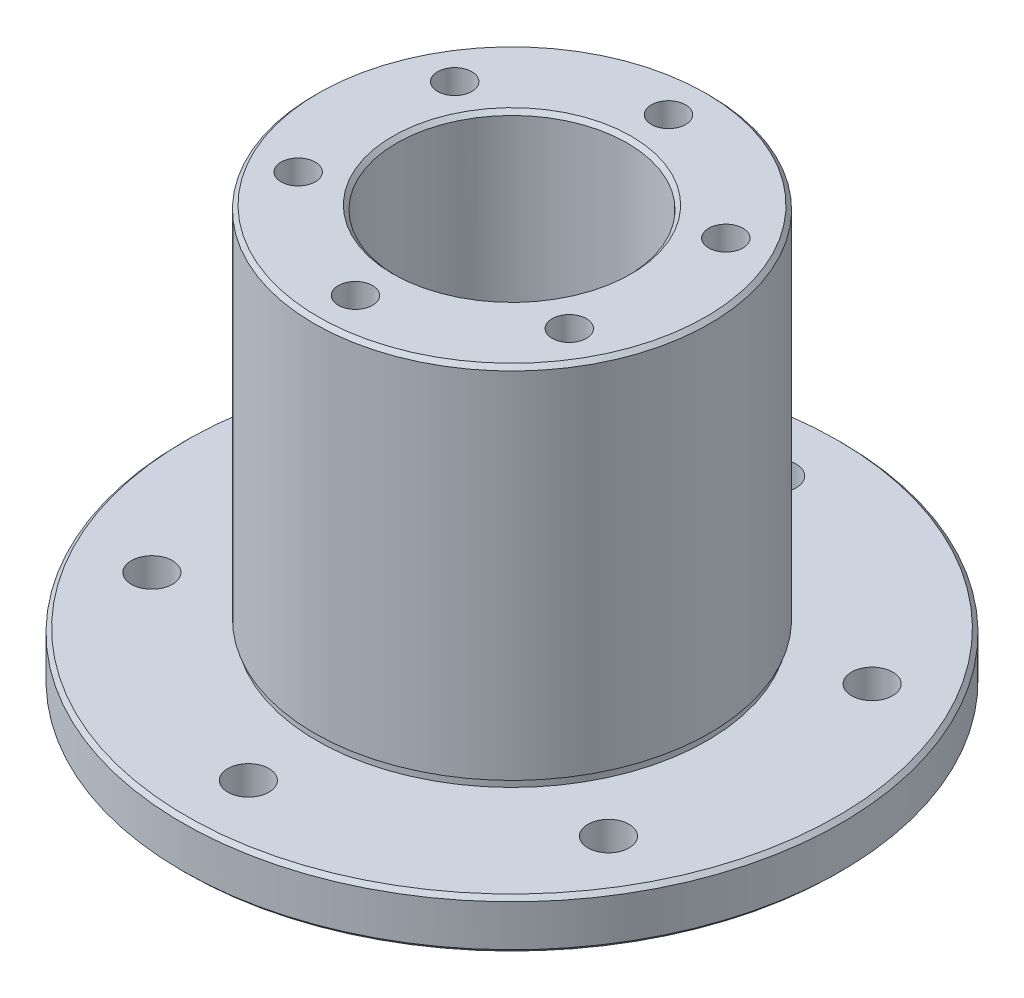
ISO-10303-21;
HEADER;
FILE_DESCRIPTION(('STEP AP214'),'2;1');
FILE_NAME('part.step','',(''),(''),'','','');
FILE_SCHEMA(('AUTOMOTIVE_DESIGN { 1 0 10303 214 1 1 1 1 }'));
ENDSEC;
DATA;
#1=APPLICATION_CONTEXT('core data for automotive mechanical design processes');
#2=APPLICATION_PROTOCOL_DEFINITION('international standard','automotive_design',2000,#1);
#3=PRODUCT_CONTEXT('',#1,'mechanical');
#4=PRODUCT('Part','Part','',(#3));
#5=PRODUCT_RELATED_PRODUCT_CATEGORY('part','',(#4));
#6=PRODUCT_DEFINITION_FORMATION('','',#4);
#7=PRODUCT_DEFINITION_CONTEXT('part definition',#1,'design');
#8=PRODUCT_DEFINITION('design','',#6,#7);
#9=PRODUCT_DEFINITION_SHAPE('','',#8);
#10=(LENGTH_UNIT() NAMED_UNIT(*) SI_UNIT(.MILLI.,.METRE.));
#11=(NAMED_UNIT(*) PLANE_ANGLE_UNIT() SI_UNIT($,.RADIAN.));
#12=(NAMED_UNIT(*) SI_UNIT($,.STERADIAN.) SOLID_ANGLE_UNIT());
#13=UNCERTAINTY_MEASURE_WITH_UNIT(LENGTH_MEASURE(1.E-05),#10,'distance_accuracy_value','');
#14=(GEOMETRIC_REPRESENTATION_CONTEXT(3) GLOBAL_UNCERTAINTY_ASSIGNED_CONTEXT((#13)) GLOBAL_UNIT_ASSIGNED_CONTEXT((#10,
#11,#12)) REPRESENTATION_CONTEXT('',''));
#15=CARTESIAN_POINT('',(0.,0.,0.));
#16=DIRECTION('',(0.,0.,1.));
#17=DIRECTION('',(1.,0.,0.));
#18=AXIS2_PLACEMENT_3D('',#15,#16,#17);
#19=CARTESIAN_POINT('',(0.,-24.5947682827518,0.));
#20=DIRECTION('',(0.,1.,0.));
#21=DIRECTION('',(0.,0.,1.));
#22=AXIS2_PLACEMENT_3D('',#19,#20,#21);
#23=CONICAL_SURFACE('',#22,31.7500000000005,0.785398163399998);
#24=CARTESIAN_POINT('',(0.,-24.9757682827508,0.));
#25=DIRECTION('',(0.,1.,0.));
#26=DIRECTION('',(0.,0.,1.));
#27=AXIS2_PLACEMENT_3D('',#24,#25,#26);
#28=CIRCLE('',#27,31.3689999999995);
#29=CARTESIAN_POINT('',(0.,-24.9757682827508,31.3689999999995));
#30=VERTEX_POINT('',#29);
#31=EDGE_CURVE('E20',#30,#30,#28,.F.);
#32=ORIENTED_EDGE('',*,*,#31,.F.);
#33=EDGE_LOOP('',(#32));
#34=FACE_BOUND('',#33,.T.);
#35=CARTESIAN_POINT('',(0.,-24.5947682827513,0.));
#36=DIRECTION('',(0.,-1.,0.));
#37=DIRECTION('',(0.,0.,-1.));
#38=AXIS2_PLACEMENT_3D('',#35,#36,#37);
#39=CIRCLE('',#38,31.75);
#40=CARTESIAN_POINT('',(0.,-24.5947682827513,-31.75));
#41=VERTEX_POINT('',#40);
#42=EDGE_CURVE('E81',#41,#41,#39,.F.);
#43=ORIENTED_EDGE('',*,*,#42,.F.);
#44=EDGE_LOOP('',(#43));
#45=FACE_BOUND('',#44,.T.);
#46=ADVANCED_FACE('F17',(#34,#45),#23,.T.);
#47=CARTESIAN_POINT('',(21.43125,-24.9757682827513,0.));
#48=DIRECTION('',(0.,-1.,0.));
#49=DIRECTION('',(0.,0.,-1.));
#50=AXIS2_PLACEMENT_3D('',#47,#48,#49);
#51=PLANE('',#50);
#52=ORIENTED_EDGE('',*,*,#31,.T.);
#53=EDGE_LOOP('',(#52));
#54=FACE_BOUND('',#53,.T.);
#55=CARTESIAN_POINT('',(0.,-24.9757682827508,0.));
#56=DIRECTION('',(0.,-1.,0.));
#57=DIRECTION('',(0.,0.,-1.));
#58=AXIS2_PLACEMENT_3D('',#55,#56,#57);
#59=CIRCLE('',#58,11.4935000000005);
#60=CARTESIAN_POINT('',(0.,-24.9757682827508,-11.4935000000005));
#61=VERTEX_POINT('',#60);
#62=EDGE_CURVE('E84',#61,#61,#59,.F.);
#63=ORIENTED_EDGE('',*,*,#62,.T.);
#64=EDGE_LOOP('',(#63));
#65=FACE_BOUND('',#64,.T.);
#66=CARTESIAN_POINT('',(0.,-24.9757682827513,25.4));
#67=DIRECTION('',(0.,-1.,0.));
#68=DIRECTION('',(0.,0.,-1.));
#69=AXIS2_PLACEMENT_3D('',#66,#67,#68);
#70=CIRCLE('',#69,1.9812);
#71=CARTESIAN_POINT('',(0.,-24.9757682827513,23.4188));
#72=VERTEX_POINT('',#71);
#73=EDGE_CURVE('E78',#72,#72,#70,.F.);
#74=ORIENTED_EDGE('',*,*,#73,.T.);
#75=EDGE_LOOP('',(#74));
#76=FACE_BOUND('',#75,.T.);
#77=CARTESIAN_POINT('',(-21.9970452561247,-24.9757682827513,12.7));
#78=DIRECTION('',(0.,-1.,0.));
#79=DIRECTION('',(0.,0.,-1.));
#80=AXIS2_PLACEMENT_3D('',#77,#78,#79);
#81=CIRCLE('',#80,1.9812);
#82=CARTESIAN_POINT('',(-21.9970452561247,-24.9757682827513,10.7188));
#83=VERTEX_POINT('',#82);
#84=EDGE_CURVE('E138',#83,#83,#81,.F.);
#85=ORIENTED_EDGE('',*,*,#84,.T.);
#86=EDGE_LOOP('',(#85));
#87=FACE_BOUND('',#86,.T.);
#88=CARTESIAN_POINT('',(-21.9970452561247,-24.9757682827513,-12.7));
#89=DIRECTION('',(0.,-1.,0.));
#90=DIRECTION('',(1.,0.,0.));
#91=AXIS2_PLACEMENT_3D('',#88,#89,#90);
#92=CIRCLE('',#91,1.9812);
#93=CARTESIAN_POINT('',(-20.0158452561247,-24.9757682827513,-12.7));
#94=VERTEX_POINT('',#93);
#95=EDGE_CURVE('E141',#94,#94,#92,.F.);
#96=ORIENTED_EDGE('',*,*,#95,.T.);
#97=EDGE_LOOP('',(#96));
#98=FACE_BOUND('',#97,.T.);
#99=CARTESIAN_POINT('',(0.,-24.9757682827513,-25.4));
#100=DIRECTION('',(0.,-1.,0.));
#101=DIRECTION('',(1.,0.,0.));
#102=AXIS2_PLACEMENT_3D('',#99,#100,#101);
#103=CIRCLE('',#102,1.9812);
#104=CARTESIAN_POINT('',(1.98119999999999,-24.9757682827513,-25.4));
#105=VERTEX_POINT('',#104);
#106=EDGE_CURVE('E144',#105,#105,#103,.F.);
#107=ORIENTED_EDGE('',*,*,#106,.T.);
#108=EDGE_LOOP('',(#107));
#109=FACE_BOUND('',#108,.T.);
#110=CARTESIAN_POINT('',(21.9970452561247,-24.9757682827513,-12.7));
#111=DIRECTION('',(0.,-1.,0.));
#112=DIRECTION('',(1.,0.,0.));
#113=AXIS2_PLACEMENT_3D('',#110,#111,#112);
#114=CIRCLE('',#113,1.9812);
#115=CARTESIAN_POINT('',(23.9782452561247,-24.9757682827513,-12.7));
#116=VERTEX_POINT('',#115);
#117=EDGE_CURVE('E147',#116,#116,#114,.F.);
#118=ORIENTED_EDGE('',*,*,#117,.T.);
#119=EDGE_LOOP('',(#118));
#120=FACE_BOUND('',#119,.T.);
#121=CARTESIAN_POINT('',(21.9970452561248,-24.9757682827513,12.7));
#122=DIRECTION('',(0.,-1.,0.));
#123=DIRECTION('',(0.,0.,-1.));
#124=AXIS2_PLACEMENT_3D('',#121,#122,#123);
#125=CIRCLE('',#124,1.9812);
#126=CARTESIAN_POINT('',(21.9970452561248,-24.9757682827513,10.7188));
#127=VERTEX_POINT('',#126);
#128=EDGE_CURVE('E150',#127,#127,#125,.F.);
#129=ORIENTED_EDGE('',*,*,#128,.T.);
#130=EDGE_LOOP('',(#129));
#131=FACE_BOUND('',#130,.T.);
#132=ADVANCED_FACE('F155',(#54,#65,#76,#87,#98,#109,#120,#131),#51,.T.);
#133=CARTESIAN_POINT('',(0.,-22.5945182827513,0.));
#134=DIRECTION('',(0.,-1.,0.));
#135=DIRECTION('',(0.,0.,-1.));
#136=AXIS2_PLACEMENT_3D('',#133,#134,#135);
#137=CYLINDRICAL_SURFACE('',#136,31.75);
#138=CARTESIAN_POINT('',(0.,-20.5942682827508,0.));
#139=DIRECTION('',(0.,-1.,0.));
#140=DIRECTION('',(-1.,0.,0.));
#141=AXIS2_PLACEMENT_3D('',#138,#139,#140);
#142=CIRCLE('',#141,31.7500000000005);
#143=CARTESIAN_POINT('',(-31.7500000000005,-20.5942682827508,0.));
#144=VERTEX_POINT('',#143);
#145=EDGE_CURVE('E73',#144,#144,#142,.F.);
#146=ORIENTED_EDGE('',*,*,#145,.F.);
#147=EDGE_LOOP('',(#146));
#148=FACE_BOUND('',#147,.T.);
#149=ORIENTED_EDGE('',*,*,#42,.T.);
#150=EDGE_LOOP('',(#149));
#151=FACE_BOUND('',#150,.T.);
#152=ADVANCED_FACE('F161',(#148,#151),#137,.T.);
#153=CARTESIAN_POINT('',(0.,-24.9757682827508,0.));
#154=DIRECTION('',(0.,-1.,0.));
#155=DIRECTION('',(0.,0.,-1.));
#156=AXIS2_PLACEMENT_3D('',#153,#154,#155);
#157=CONICAL_SURFACE('',#156,11.4935000000005,0.78539816340001);
#158=CARTESIAN_POINT('',(0.,-24.5947682827513,0.));
#159=DIRECTION('',(0.,-1.,0.));
#160=DIRECTION('',(0.,0.,-1.));
#161=AXIS2_PLACEMENT_3D('',#158,#159,#160);
#162=CIRCLE('',#161,11.1125);
#163=CARTESIAN_POINT('',(0.,-24.5947682827513,-11.1125));
#164=VERTEX_POINT('',#163);
#165=EDGE_CURVE('E69',#164,#164,#162,.F.);
#166=ORIENTED_EDGE('',*,*,#165,.T.);
#167=EDGE_LOOP('',(#166));
#168=FACE_BOUND('',#167,.T.);
#169=ORIENTED_EDGE('',*,*,#62,.F.);
#170=EDGE_LOOP('',(#169));
#171=FACE_BOUND('',#170,.T.);
#172=ADVANCED_FACE('F158',(#168,#171),#157,.F.);
#173=CARTESIAN_POINT('',(21.9970452561247,73.3603120349529,12.7));
#174=DIRECTION('',(0.,-1.,0.));
#175=DIRECTION('',(0.,0.,-1.));
#176=AXIS2_PLACEMENT_3D('',#173,#174,#175);
#177=CYLINDRICAL_SURFACE('',#176,1.9812);
#178=ORIENTED_EDGE('',*,*,#128,.F.);
#179=EDGE_LOOP('',(#178));
#180=FACE_BOUND('',#179,.T.);
#181=CARTESIAN_POINT('',(21.9970452561248,-20.2132682827513,12.7));
#182=DIRECTION('',(0.,-1.,0.));
#183=DIRECTION('',(0.,0.,-1.));
#184=AXIS2_PLACEMENT_3D('',#181,#182,#183);
#185=CIRCLE('',#184,1.9812);
#186=CARTESIAN_POINT('',(21.9970452561248,-20.2132682827513,10.7188));
#187=VERTEX_POINT('',#186);
#188=EDGE_CURVE('E72',#187,#187,#185,.T.);
#189=ORIENTED_EDGE('',*,*,#188,.F.);
#190=EDGE_LOOP('',(#189));
#191=FACE_BOUND('',#190,.T.);
#192=ADVANCED_FACE('F160',(#180,#191),#177,.F.);
#193=CARTESIAN_POINT('',(21.9970452561247,73.3603120349529,-12.7));
#194=DIRECTION('',(0.,-1.,0.));
#195=DIRECTION('',(1.,0.,0.));
#196=AXIS2_PLACEMENT_3D('',#193,#194,#195);
#197=CYLINDRICAL_SURFACE('',#196,1.9812);
#198=ORIENTED_EDGE('',*,*,#117,.F.);
#199=EDGE_LOOP('',(#198));
#200=FACE_BOUND('',#199,.T.);
#201=CARTESIAN_POINT('',(21.9970452561247,-20.2132682827513,-12.7));
#202=DIRECTION('',(0.,-1.,0.));
#203=DIRECTION('',(1.,0.,0.));
#204=AXIS2_PLACEMENT_3D('',#201,#202,#203);
#205=CIRCLE('',#204,1.9812);
#206=CARTESIAN_POINT('',(23.9782452561247,-20.2132682827513,-12.7));
#207=VERTEX_POINT('',#206);
#208=EDGE_CURVE('E131',#207,#207,#205,.T.);
#209=ORIENTED_EDGE('',*,*,#208,.F.);
#210=EDGE_LOOP('',(#209));
#211=FACE_BOUND('',#210,.T.);
#212=ADVANCED_FACE('F169',(#200,#211),#197,.F.);
#213=CARTESIAN_POINT('',(0.,73.3603120349529,-25.4));
#214=DIRECTION('',(0.,-1.,0.));
#215=DIRECTION('',(1.,0.,0.));
#216=AXIS2_PLACEMENT_3D('',#213,#214,#215);
#217=CYLINDRICAL_SURFACE('',#216,1.9812);
#218=ORIENTED_EDGE('',*,*,#106,.F.);
#219=EDGE_LOOP('',(#218));
#220=FACE_BOUND('',#219,.T.);
#221=CARTESIAN_POINT('',(0.,-20.2132682827513,-25.4));
#222=DIRECTION('',(0.,-1.,0.));
#223=DIRECTION('',(1.,0.,0.));
#224=AXIS2_PLACEMENT_3D('',#221,#222,#223);
#225=CIRCLE('',#224,1.9812);
#226=CARTESIAN_POINT('',(1.98119999999999,-20.2132682827513,-25.4));
#227=VERTEX_POINT('',#226);
#228=EDGE_CURVE('E128',#227,#227,#225,.T.);
#229=ORIENTED_EDGE('',*,*,#228,.F.);
#230=EDGE_LOOP('',(#229));
#231=FACE_BOUND('',#230,.T.);
#232=ADVANCED_FACE('F264',(#220,#231),#217,.F.);
#233=CARTESIAN_POINT('',(-21.9970452561248,73.3603120349529,-12.7));
#234=DIRECTION('',(0.,-1.,0.));
#235=DIRECTION('',(1.,0.,0.));
#236=AXIS2_PLACEMENT_3D('',#233,#234,#235);
#237=CYLINDRICAL_SURFACE('',#236,1.9812);
#238=ORIENTED_EDGE('',*,*,#95,.F.);
#239=EDGE_LOOP('',(#238));
#240=FACE_BOUND('',#239,.T.);
#241=CARTESIAN_POINT('',(-21.9970452561247,-20.2132682827513,-12.7));
#242=DIRECTION('',(0.,-1.,0.));
#243=DIRECTION('',(1.,0.,0.));
#244=AXIS2_PLACEMENT_3D('',#241,#242,#243);
#245=CIRCLE('',#244,1.9812);
#246=CARTESIAN_POINT('',(-20.0158452561247,-20.2132682827513,-12.7));
#247=VERTEX_POINT('',#246);
#248=EDGE_CURVE('E125',#247,#247,#245,.T.);
#249=ORIENTED_EDGE('',*,*,#248,.F.);
#250=EDGE_LOOP('',(#249));
#251=FACE_BOUND('',#250,.T.);
#252=ADVANCED_FACE('F260',(#240,#251),#237,.F.);
#253=CARTESIAN_POINT('',(-21.9970452561247,73.3603120349529,12.7));
#254=DIRECTION('',(0.,-1.,0.));
#255=DIRECTION('',(0.,0.,-1.));
#256=AXIS2_PLACEMENT_3D('',#253,#254,#255);
#257=CYLINDRICAL_SURFACE('',#256,1.9812);
#258=ORIENTED_EDGE('',*,*,#84,.F.);
#259=EDGE_LOOP('',(#258));
#260=FACE_BOUND('',#259,.T.);
#261=CARTESIAN_POINT('',(-21.9970452561247,-20.2132682827513,12.7));
#262=DIRECTION('',(0.,-1.,0.));
#263=DIRECTION('',(0.,0.,-1.));
#264=AXIS2_PLACEMENT_3D('',#261,#262,#263);
#265=CIRCLE('',#264,1.9812);
#266=CARTESIAN_POINT('',(-21.9970452561247,-20.2132682827513,10.7188));
#267=VERTEX_POINT('',#266);
#268=EDGE_CURVE('E122',#267,#267,#265,.T.);
#269=ORIENTED_EDGE('',*,*,#268,.F.);
#270=EDGE_LOOP('',(#269));
#271=FACE_BOUND('',#270,.T.);
#272=ADVANCED_FACE('F256',(#260,#271),#257,.F.);
#273=CARTESIAN_POINT('',(0.,73.3603120349529,25.4));
#274=DIRECTION('',(0.,-1.,0.));
#275=DIRECTION('',(0.,0.,-1.));
#276=AXIS2_PLACEMENT_3D('',#273,#274,#275);
#277=CYLINDRICAL_SURFACE('',#276,1.9812);
#278=ORIENTED_EDGE('',*,*,#73,.F.);
#279=EDGE_LOOP('',(#278));
#280=FACE_BOUND('',#279,.T.);
#281=CARTESIAN_POINT('',(0.,-20.2132682827513,25.4));
#282=DIRECTION('',(0.,-1.,0.));
#283=DIRECTION('',(0.,0.,-1.));
#284=AXIS2_PLACEMENT_3D('',#281,#282,#283);
#285=CIRCLE('',#284,1.9812);
#286=CARTESIAN_POINT('',(0.,-20.2132682827513,23.4188));
#287=VERTEX_POINT('',#286);
#288=EDGE_CURVE('E62',#287,#287,#285,.T.);
#289=ORIENTED_EDGE('',*,*,#288,.F.);
#290=EDGE_LOOP('',(#289));
#291=FACE_BOUND('',#290,.T.);
#292=ADVANCED_FACE('F252',(#280,#291),#277,.F.);
#293=CARTESIAN_POINT('',(0.,-20.5942682827508,0.));
#294=DIRECTION('',(0.,-1.,0.));
#295=DIRECTION('',(0.,0.,-1.));
#296=AXIS2_PLACEMENT_3D('',#293,#294,#295);
#297=CONICAL_SURFACE('',#296,31.7500000000005,0.785398163400003);
#298=ORIENTED_EDGE('',*,*,#145,.T.);
#299=EDGE_LOOP('',(#298));
#300=FACE_BOUND('',#299,.T.);
#301=CARTESIAN_POINT('',(0.,-20.2132682827518,0.));
#302=DIRECTION('',(0.,-1.,0.));
#303=DIRECTION('',(0.,0.,-1.));
#304=AXIS2_PLACEMENT_3D('',#301,#302,#303);
#305=CIRCLE('',#304,31.3689999999995);
#306=CARTESIAN_POINT('',(0.,-20.2132682827518,-31.3689999999995));
#307=VERTEX_POINT('',#306);
#308=EDGE_CURVE('E56',#307,#307,#305,.F.);
#309=ORIENTED_EDGE('',*,*,#308,.F.);
#310=EDGE_LOOP('',(#309));
#311=FACE_BOUND('',#310,.T.);
#312=ADVANCED_FACE('F49',(#300,#311),#297,.T.);
#313=CARTESIAN_POINT('',(0.,5.56773171729219,-15.08125));
#314=DIRECTION('',(0.,1.,0.));
#315=DIRECTION('',(0.,0.,1.));
#316=AXIS2_PLACEMENT_3D('',#313,#314,#315);
#317=CONICAL_SURFACE('',#316,1.65100000003804,1.02974425861455);
#318=CARTESIAN_POINT('',(-1.13686837721616E-10,4.5757108351836,-15.08125));
#319=VERTEX_POINT('',#318);
#320=VERTEX_LOOP('',#319);
#321=FACE_BOUND('',#320,.T.);
#322=CARTESIAN_POINT('',(0.,5.56773171724869,-15.08125));
#323=DIRECTION('',(0.,1.,0.));
#324=DIRECTION('',(0.,0.,1.));
#325=AXIS2_PLACEMENT_3D('',#322,#323,#324);
#326=CIRCLE('',#325,1.651);
#327=CARTESIAN_POINT('',(0.,5.56773171724869,-13.43025));
#328=VERTEX_POINT('',#327);
#329=EDGE_CURVE('E53',#328,#328,#326,.T.);
#330=ORIENTED_EDGE('',*,*,#329,.T.);
#331=EDGE_LOOP('',(#330));
#332=FACE_BOUND('',#331,.T.);
#333=ADVANCED_FACE('F45',(#321,#332),#317,.F.);
#334=CARTESIAN_POINT('',(-13.0607456208241,5.56773171734903,-7.540625));
#335=DIRECTION('',(0.,1.,0.));
#336=DIRECTION('',(0.,0.,1.));
#337=AXIS2_PLACEMENT_3D('',#334,#335,#336);
#338=CONICAL_SURFACE('',#337,1.65100000011354,1.02974425866515);
#339=CARTESIAN_POINT('',(-13.0607456207485,4.57571083529729,-7.540625));
#340=VERTEX_POINT('',#339);
#341=VERTEX_LOOP('',#340);
#342=FACE_BOUND('',#341,.T.);
#343=CARTESIAN_POINT('',(-13.0607456208241,5.56773171724869,-7.540625));
#344=DIRECTION('',(0.,1.,0.));
#345=DIRECTION('',(0.,0.,1.));
#346=AXIS2_PLACEMENT_3D('',#343,#344,#345);
#347=CIRCLE('',#346,1.651);
#348=CARTESIAN_POINT('',(-13.0607456208241,5.56773171724869,-5.889625));
#349=VERTEX_POINT('',#348);
#350=EDGE_CURVE('E55',#349,#349,#347,.T.);
#351=ORIENTED_EDGE('',*,*,#350,.T.);
#352=EDGE_LOOP('',(#351));
#353=FACE_BOUND('',#352,.T.);
#354=ADVANCED_FACE('F48',(#342,#353),#338,.F.);
#355=CARTESIAN_POINT('',(-13.0607456208241,5.56773171734903,7.540625));
#356=DIRECTION('',(0.,1.,0.));
#357=DIRECTION('',(0.,0.,1.));
#358=AXIS2_PLACEMENT_3D('',#355,#356,#357);
#359=CONICAL_SURFACE('',#358,1.65100000011354,1.02974425866515);
#360=CARTESIAN_POINT('',(-13.0607456207485,4.57571083529729,7.540625));
#361=VERTEX_POINT('',#360);
#362=VERTEX_LOOP('',#361);
#363=FACE_BOUND('',#362,.T.);
#364=CARTESIAN_POINT('',(-13.0607456208241,5.56773171724869,7.540625));
#365=DIRECTION('',(0.,1.,0.));
#366=DIRECTION('',(0.,0.,1.));
#367=AXIS2_PLACEMENT_3D('',#364,#365,#366);
#368=CIRCLE('',#367,1.651);
#369=CARTESIAN_POINT('',(-13.0607456208241,5.56773171724869,9.191625));
#370=VERTEX_POINT('',#369);
#371=EDGE_CURVE('E59',#370,#370,#368,.T.);
#372=ORIENTED_EDGE('',*,*,#371,.T.);
#373=EDGE_LOOP('',(#372));
#374=FACE_BOUND('',#373,.T.);
#375=ADVANCED_FACE('F243',(#363,#374),#359,.F.);
#376=CARTESIAN_POINT('',(0.,5.56773171729219,15.08125));
#377=DIRECTION('',(0.,1.,0.));
#378=DIRECTION('',(0.,0.,1.));
#379=AXIS2_PLACEMENT_3D('',#376,#377,#378);
#380=CONICAL_SURFACE('',#379,1.65100000003804,1.02974425861456);
#381=CARTESIAN_POINT('',(-1.13686837721616E-10,4.5757108351836,15.08125));
#382=VERTEX_POINT('',#381);
#383=VERTEX_LOOP('',#382);
#384=FACE_BOUND('',#383,.T.);
#385=CARTESIAN_POINT('',(0.,5.56773171724869,15.08125));
#386=DIRECTION('',(0.,1.,0.));
#387=DIRECTION('',(0.,0.,1.));
#388=AXIS2_PLACEMENT_3D('',#385,#386,#387);
#389=CIRCLE('',#388,1.651);
#390=CARTESIAN_POINT('',(0.,5.56773171724869,16.73225));
#391=VERTEX_POINT('',#390);
#392=EDGE_CURVE('E518',#391,#391,#389,.T.);
#393=ORIENTED_EDGE('',*,*,#392,.T.);
#394=EDGE_LOOP('',(#393));
#395=FACE_BOUND('',#394,.T.);
#396=ADVANCED_FACE('F239',(#384,#395),#380,.F.);
#397=CARTESIAN_POINT('',(13.0607456208241,5.56773171723535,7.540625));
#398=DIRECTION('',(0.,1.,0.));
#399=DIRECTION('',(0.,0.,1.));
#400=AXIS2_PLACEMENT_3D('',#397,#398,#399);
#401=CONICAL_SURFACE('',#400,1.65100000001938,1.02974425870054);
#402=CARTESIAN_POINT('',(13.0607456209191,4.57571083529729,7.540625));
#403=VERTEX_POINT('',#402);
#404=VERTEX_LOOP('',#403);
#405=FACE_BOUND('',#404,.T.);
#406=CARTESIAN_POINT('',(13.0607456208241,5.56773171724869,7.540625));
#407=DIRECTION('',(0.,1.,0.));
#408=DIRECTION('',(0.,0.,1.));
#409=AXIS2_PLACEMENT_3D('',#406,#407,#408);
#410=CIRCLE('',#409,1.651);
#411=CARTESIAN_POINT('',(13.0607456208241,5.56773171724869,9.191625));
#412=VERTEX_POINT('',#411);
#413=EDGE_CURVE('E521',#412,#412,#410,.T.);
#414=ORIENTED_EDGE('',*,*,#413,.T.);
#415=EDGE_LOOP('',(#414));
#416=FACE_BOUND('',#415,.T.);
#417=ADVANCED_FACE('F236',(#405,#416),#401,.F.);
#418=CARTESIAN_POINT('',(13.0607456208241,5.56773171723535,-7.540625));
#419=DIRECTION('',(0.,1.,0.));
#420=DIRECTION('',(0.,0.,1.));
#421=AXIS2_PLACEMENT_3D('',#418,#419,#420);
#422=CONICAL_SURFACE('',#421,1.65100000001938,1.02974425870054);
#423=CARTESIAN_POINT('',(13.0607456209191,4.57571083529729,-7.540625));
#424=VERTEX_POINT('',#423);
#425=VERTEX_LOOP('',#424);
#426=FACE_BOUND('',#425,.T.);
#427=CARTESIAN_POINT('',(13.0607456208241,5.56773171724869,-7.540625));
#428=DIRECTION('',(0.,1.,0.));
#429=DIRECTION('',(0.,0.,1.));
#430=AXIS2_PLACEMENT_3D('',#427,#428,#429);
#431=CIRCLE('',#430,1.651);
#432=CARTESIAN_POINT('',(13.0607456208241,5.56773171724869,-5.889625));
#433=VERTEX_POINT('',#432);
#434=EDGE_CURVE('E532',#433,#433,#431,.T.);
#435=ORIENTED_EDGE('',*,*,#434,.T.);
#436=EDGE_LOOP('',(#435));
#437=FACE_BOUND('',#436,.T.);
#438=ADVANCED_FACE('F232',(#426,#437),#422,.F.);
#439=CARTESIAN_POINT('',(0.,-4.94151828275131,0.));
#440=DIRECTION('',(0.,-1.,0.));
#441=DIRECTION('',(0.,0.,-1.));
#442=AXIS2_PLACEMENT_3D('',#439,#440,#441);
#443=CYLINDRICAL_SURFACE('',#442,11.1125);
#444=ORIENTED_EDGE('',*,*,#165,.F.);
#445=EDGE_LOOP('',(#444));
#446=FACE_BOUND('',#445,.T.);
#447=CARTESIAN_POINT('',(0.,14.7117317172492,0.));
#448=DIRECTION('',(0.,1.,0.));
#449=DIRECTION('',(-1.,0.,0.));
#450=AXIS2_PLACEMENT_3D('',#447,#448,#449);
#451=CIRCLE('',#450,11.1124999999995);
#452=CARTESIAN_POINT('',(-11.1124999999995,14.7117317172492,0.));
#453=VERTEX_POINT('',#452);
#454=EDGE_CURVE('E118',#453,#453,#451,.T.);
#455=ORIENTED_EDGE('',*,*,#454,.T.);
#456=EDGE_LOOP('',(#455));
#457=FACE_BOUND('',#456,.T.);
#458=ADVANCED_FACE('F228',(#446,#457),#443,.F.);
#459=CARTESIAN_POINT('',(25.273,-20.2132682827513,0.));
#460=DIRECTION('',(0.,1.,0.));
#461=DIRECTION('',(0.,0.,1.));
#462=AXIS2_PLACEMENT_3D('',#459,#460,#461);
#463=PLANE('',#462);
#464=ORIENTED_EDGE('',*,*,#308,.T.);
#465=EDGE_LOOP('',(#464));
#466=FACE_BOUND('',#465,.T.);
#467=CARTESIAN_POINT('',(0.,-20.2132682827513,0.));
#468=DIRECTION('',(0.,-1.,0.));
#469=DIRECTION('',(0.,0.,-1.));
#470=AXIS2_PLACEMENT_3D('',#467,#468,#469);
#471=CIRCLE('',#470,18.796);
#472=CARTESIAN_POINT('',(0.,-20.2132682827513,-18.796));
#473=VERTEX_POINT('',#472);
#474=EDGE_CURVE('E116',#473,#473,#471,.F.);
#475=ORIENTED_EDGE('',*,*,#474,.F.);
#476=EDGE_LOOP('',(#475));
#477=FACE_BOUND('',#476,.T.);
#478=ORIENTED_EDGE('',*,*,#288,.T.);
#479=EDGE_LOOP('',(#478));
#480=FACE_BOUND('',#479,.T.);
#481=ORIENTED_EDGE('',*,*,#268,.T.);
#482=EDGE_LOOP('',(#481));
#483=FACE_BOUND('',#482,.T.);
#484=ORIENTED_EDGE('',*,*,#248,.T.);
#485=EDGE_LOOP('',(#484));
#486=FACE_BOUND('',#485,.T.);
#487=ORIENTED_EDGE('',*,*,#228,.T.);
#488=EDGE_LOOP('',(#487));
#489=FACE_BOUND('',#488,.T.);
#490=ORIENTED_EDGE('',*,*,#208,.T.);
#491=EDGE_LOOP('',(#490));
#492=FACE_BOUND('',#491,.T.);
#493=ORIENTED_EDGE('',*,*,#188,.T.);
#494=EDGE_LOOP('',(#493));
#495=FACE_BOUND('',#494,.T.);
#496=ADVANCED_FACE('F225',(#466,#477,#480,#483,#486,#489,#492,#495),#463,.T.);
#497=CARTESIAN_POINT('',(0.,10.3302317172487,-15.08125));
#498=DIRECTION('',(0.,1.,0.));
#499=DIRECTION('',(0.,0.,1.));
#500=AXIS2_PLACEMENT_3D('',#497,#498,#499);
#501=CYLINDRICAL_SURFACE('',#500,1.651);
#502=ORIENTED_EDGE('',*,*,#329,.F.);
#503=EDGE_LOOP('',(#502));
#504=FACE_BOUND('',#503,.T.);
#505=CARTESIAN_POINT('',(0.,15.0927317172487,-15.08125));
#506=DIRECTION('',(0.,1.,0.));
#507=DIRECTION('',(0.,0.,1.));
#508=AXIS2_PLACEMENT_3D('',#505,#506,#507);
#509=CIRCLE('',#508,1.651);
#510=CARTESIAN_POINT('',(0.,15.0927317172487,-13.43025));
#511=VERTEX_POINT('',#510);
#512=EDGE_CURVE('E113',#511,#511,#509,.F.);
#513=ORIENTED_EDGE('',*,*,#512,.F.);
#514=EDGE_LOOP('',(#513));
#515=FACE_BOUND('',#514,.T.);
#516=ADVANCED_FACE('F221',(#504,#515),#501,.F.);
#517=CARTESIAN_POINT('',(-13.0607456208241,10.3302317172487,-7.540625));
#518=DIRECTION('',(0.,1.,0.));
#519=DIRECTION('',(0.,0.,1.));
#520=AXIS2_PLACEMENT_3D('',#517,#518,#519);
#521=CYLINDRICAL_SURFACE('',#520,1.651);
#522=ORIENTED_EDGE('',*,*,#350,.F.);
#523=EDGE_LOOP('',(#522));
#524=FACE_BOUND('',#523,.T.);
#525=CARTESIAN_POINT('',(-13.0607456208241,15.0927317172487,-7.540625));
#526=DIRECTION('',(0.,1.,0.));
#527=DIRECTION('',(0.,0.,1.));
#528=AXIS2_PLACEMENT_3D('',#525,#526,#527);
#529=CIRCLE('',#528,1.651);
#530=CARTESIAN_POINT('',(-13.0607456208241,15.0927317172487,-5.889625));
#531=VERTEX_POINT('',#530);
#532=EDGE_CURVE('E110',#531,#531,#529,.F.);
#533=ORIENTED_EDGE('',*,*,#532,.F.);
#534=EDGE_LOOP('',(#533));
#535=FACE_BOUND('',#534,.T.);
#536=ADVANCED_FACE('F217',(#524,#535),#521,.F.);
#537=CARTESIAN_POINT('',(-13.0607456208241,10.3302317172487,7.540625));
#538=DIRECTION('',(0.,1.,0.));
#539=DIRECTION('',(0.,0.,1.));
#540=AXIS2_PLACEMENT_3D('',#537,#538,#539);
#541=CYLINDRICAL_SURFACE('',#540,1.651);
#542=ORIENTED_EDGE('',*,*,#371,.F.);
#543=EDGE_LOOP('',(#542));
#544=FACE_BOUND('',#543,.T.);
#545=CARTESIAN_POINT('',(-13.0607456208241,15.0927317172487,7.540625));
#546=DIRECTION('',(0.,1.,0.));
#547=DIRECTION('',(0.,0.,1.));
#548=AXIS2_PLACEMENT_3D('',#545,#546,#547);
#549=CIRCLE('',#548,1.651);
#550=CARTESIAN_POINT('',(-13.0607456208241,15.0927317172487,9.191625));
#551=VERTEX_POINT('',#550);
#552=EDGE_CURVE('E107',#551,#551,#549,.F.);
#553=ORIENTED_EDGE('',*,*,#552,.F.);
#554=EDGE_LOOP('',(#553));
#555=FACE_BOUND('',#554,.T.);
#556=ADVANCED_FACE('F213',(#544,#555),#541,.F.);
#557=CARTESIAN_POINT('',(0.,10.3302317172487,15.08125));
#558=DIRECTION('',(0.,1.,0.));
#559=DIRECTION('',(0.,0.,1.));
#560=AXIS2_PLACEMENT_3D('',#557,#558,#559);
#561=CYLINDRICAL_SURFACE('',#560,1.651);
#562=ORIENTED_EDGE('',*,*,#392,.F.);
#563=EDGE_LOOP('',(#562));
#564=FACE_BOUND('',#563,.T.);
#565=CARTESIAN_POINT('',(0.,15.0927317172487,15.08125));
#566=DIRECTION('',(0.,1.,0.));
#567=DIRECTION('',(0.,0.,1.));
#568=AXIS2_PLACEMENT_3D('',#565,#566,#567);
#569=CIRCLE('',#568,1.651);
#570=CARTESIAN_POINT('',(0.,15.0927317172487,16.73225));
#571=VERTEX_POINT('',#570);
#572=EDGE_CURVE('E104',#571,#571,#569,.F.);
#573=ORIENTED_EDGE('',*,*,#572,.F.);
#574=EDGE_LOOP('',(#573));
#575=FACE_BOUND('',#574,.T.);
#576=ADVANCED_FACE('F209',(#564,#575),#561,.F.);
#577=CARTESIAN_POINT('',(13.0607456208241,10.3302317172487,7.540625));
#578=DIRECTION('',(0.,1.,0.));
#579=DIRECTION('',(0.,0.,1.));
#580=AXIS2_PLACEMENT_3D('',#577,#578,#579);
#581=CYLINDRICAL_SURFACE('',#580,1.651);
#582=ORIENTED_EDGE('',*,*,#413,.F.);
#583=EDGE_LOOP('',(#582));
#584=FACE_BOUND('',#583,.T.);
#585=CARTESIAN_POINT('',(13.0607456208241,15.0927317172487,7.540625));
#586=DIRECTION('',(0.,1.,0.));
#587=DIRECTION('',(0.,0.,1.));
#588=AXIS2_PLACEMENT_3D('',#585,#586,#587);
#589=CIRCLE('',#588,1.651);
#590=CARTESIAN_POINT('',(13.0607456208241,15.0927317172487,9.191625));
#591=VERTEX_POINT('',#590);
#592=EDGE_CURVE('E101',#591,#591,#589,.F.);
#593=ORIENTED_EDGE('',*,*,#592,.F.);
#594=EDGE_LOOP('',(#593));
#595=FACE_BOUND('',#594,.T.);
#596=ADVANCED_FACE('F205',(#584,#595),#581,.F.);
#597=CARTESIAN_POINT('',(13.0607456208241,10.3302317172487,-7.540625));
#598=DIRECTION('',(0.,1.,0.));
#599=DIRECTION('',(0.,0.,1.));
#600=AXIS2_PLACEMENT_3D('',#597,#598,#599);
#601=CYLINDRICAL_SURFACE('',#600,1.651);
#602=ORIENTED_EDGE('',*,*,#434,.F.);
#603=EDGE_LOOP('',(#602));
#604=FACE_BOUND('',#603,.T.);
#605=CARTESIAN_POINT('',(13.0607456208241,15.0927317172487,-7.540625));
#606=DIRECTION('',(0.,1.,0.));
#607=DIRECTION('',(0.,0.,1.));
#608=AXIS2_PLACEMENT_3D('',#605,#606,#607);
#609=CIRCLE('',#608,1.651);
#610=CARTESIAN_POINT('',(13.0607456208241,15.0927317172487,-5.889625));
#611=VERTEX_POINT('',#610);
#612=EDGE_CURVE('E98',#611,#611,#609,.F.);
#613=ORIENTED_EDGE('',*,*,#612,.F.);
#614=EDGE_LOOP('',(#613));
#615=FACE_BOUND('',#614,.T.);
#616=ADVANCED_FACE('F201',(#604,#615),#601,.F.);
#617=CARTESIAN_POINT('',(0.,15.0927317172482,0.));
#618=DIRECTION('',(0.,1.,0.));
#619=DIRECTION('',(0.,0.,1.));
#620=AXIS2_PLACEMENT_3D('',#617,#618,#619);
#621=CONICAL_SURFACE('',#620,11.4935000000005,0.785398163399993);
#622=CARTESIAN_POINT('',(0.,15.0927317172482,0.));
#623=DIRECTION('',(0.,1.,0.));
#624=DIRECTION('',(0.,0.,1.));
#625=AXIS2_PLACEMENT_3D('',#622,#623,#624);
#626=CIRCLE('',#625,11.4935000000005);
#627=CARTESIAN_POINT('',(0.,15.0927317172482,11.4935000000005));
#628=VERTEX_POINT('',#627);
#629=EDGE_CURVE('E95',#628,#628,#626,.F.);
#630=ORIENTED_EDGE('',*,*,#629,.F.);
#631=EDGE_LOOP('',(#630));
#632=FACE_BOUND('',#631,.T.);
#633=ORIENTED_EDGE('',*,*,#454,.F.);
#634=EDGE_LOOP('',(#633));
#635=FACE_BOUND('',#634,.T.);
#636=ADVANCED_FACE('F197',(#632,#635),#621,.F.);
#637=CARTESIAN_POINT('',(0.,-19.8322682827513,0.));
#638=DIRECTION('',(0.,-1.,0.));
#639=DIRECTION('',(0.,0.,-1.));
#640=AXIS2_PLACEMENT_3D('',#637,#638,#639);
#641=CYLINDRICAL_SURFACE('',#640,18.796);
#642=CARTESIAN_POINT('',(0.,-19.4512682827513,0.));
#643=DIRECTION('',(0.,-1.,0.));
#644=DIRECTION('',(0.,0.,-1.));
#645=AXIS2_PLACEMENT_3D('',#642,#643,#644);
#646=CIRCLE('',#645,18.796);
#647=CARTESIAN_POINT('',(0.,-19.4512682827513,-18.796));
#648=VERTEX_POINT('',#647);
#649=EDGE_CURVE('E92',#648,#648,#646,.F.);
#650=ORIENTED_EDGE('',*,*,#649,.F.);
#651=EDGE_LOOP('',(#650));
#652=FACE_BOUND('',#651,.T.);
#653=ORIENTED_EDGE('',*,*,#474,.T.);
#654=EDGE_LOOP('',(#653));
#655=FACE_BOUND('',#654,.T.);
#656=ADVANCED_FACE('F193',(#652,#655),#641,.T.);
#657=CARTESIAN_POINT('',(15.08125,15.0927317172487,0.));
#658=DIRECTION('',(0.,1.,0.));
#659=DIRECTION('',(0.,0.,1.));
#660=AXIS2_PLACEMENT_3D('',#657,#658,#659);
#661=PLANE('',#660);
#662=ORIENTED_EDGE('',*,*,#629,.T.);
#663=EDGE_LOOP('',(#662));
#664=FACE_BOUND('',#663,.T.);
#665=ORIENTED_EDGE('',*,*,#612,.T.);
#666=EDGE_LOOP('',(#665));
#667=FACE_BOUND('',#666,.T.);
#668=ORIENTED_EDGE('',*,*,#592,.T.);
#669=EDGE_LOOP('',(#668));
#670=FACE_BOUND('',#669,.T.);
#671=ORIENTED_EDGE('',*,*,#572,.T.);
#672=EDGE_LOOP('',(#671));
#673=FACE_BOUND('',#672,.T.);
#674=ORIENTED_EDGE('',*,*,#552,.T.);
#675=EDGE_LOOP('',(#674));
#676=FACE_BOUND('',#675,.T.);
#677=ORIENTED_EDGE('',*,*,#532,.T.);
#678=EDGE_LOOP('',(#677));
#679=FACE_BOUND('',#678,.T.);
#680=ORIENTED_EDGE('',*,*,#512,.T.);
#681=EDGE_LOOP('',(#680));
#682=FACE_BOUND('',#681,.T.);
#683=CARTESIAN_POINT('',(0.,15.0927317172482,0.));
#684=DIRECTION('',(0.,-1.,0.));
#685=DIRECTION('',(0.,0.,-1.));
#686=AXIS2_PLACEMENT_3D('',#683,#684,#685);
#687=CIRCLE('',#686,18.6689999999995);
#688=CARTESIAN_POINT('',(0.,15.0927317172482,-18.6689999999995));
#689=VERTEX_POINT('',#688);
#690=EDGE_CURVE('E89',#689,#689,#687,.T.);
#691=ORIENTED_EDGE('',*,*,#690,.F.);
#692=EDGE_LOOP('',(#691));
#693=FACE_BOUND('',#692,.T.);
#694=ADVANCED_FACE('F189',(#664,#667,#670,#673,#676,#679,#682,#693),#661,.T.);
#695=CARTESIAN_POINT('',(18.923,-19.4512682827513,0.));
#696=DIRECTION('',(0.,-1.,0.));
#697=DIRECTION('',(0.,0.,-1.));
#698=AXIS2_PLACEMENT_3D('',#695,#696,#697);
#699=PLANE('',#698);
#700=CARTESIAN_POINT('',(0.,-19.4512682827513,0.));
#701=DIRECTION('',(0.,-1.,0.));
#702=DIRECTION('',(0.,0.,-1.));
#703=AXIS2_PLACEMENT_3D('',#700,#701,#702);
#704=CIRCLE('',#703,19.05);
#705=CARTESIAN_POINT('',(0.,-19.4512682827513,-19.05));
#706=VERTEX_POINT('',#705);
#707=EDGE_CURVE('E26',#706,#706,#704,.F.);
#708=ORIENTED_EDGE('',*,*,#707,.F.);
#709=EDGE_LOOP('',(#708));
#710=FACE_BOUND('',#709,.T.);
#711=ORIENTED_EDGE('',*,*,#649,.T.);
#712=EDGE_LOOP('',(#711));
#713=FACE_BOUND('',#712,.T.);
#714=ADVANCED_FACE('F182',(#710,#713),#699,.T.);
#715=CARTESIAN_POINT('',(0.,14.7117317172492,0.));
#716=DIRECTION('',(0.,-1.,0.));
#717=DIRECTION('',(0.,0.,-1.));
#718=AXIS2_PLACEMENT_3D('',#715,#716,#717);
#719=CONICAL_SURFACE('',#718,19.0500000000005,0.7853981634);
#720=CARTESIAN_POINT('',(0.,14.7117317172487,0.));
#721=DIRECTION('',(0.,-1.,0.));
#722=DIRECTION('',(0.,0.,-1.));
#723=AXIS2_PLACEMENT_3D('',#720,#721,#722);
#724=CIRCLE('',#723,19.05);
#725=CARTESIAN_POINT('',(0.,14.7117317172487,-19.05));
#726=VERTEX_POINT('',#725);
#727=EDGE_CURVE('E11',#726,#726,#724,.T.);
#728=ORIENTED_EDGE('',*,*,#727,.F.);
#729=EDGE_LOOP('',(#728));
#730=FACE_BOUND('',#729,.T.);
#731=ORIENTED_EDGE('',*,*,#690,.T.);
#732=EDGE_LOOP('',(#731));
#733=FACE_BOUND('',#732,.T.);
#734=ADVANCED_FACE('F176',(#730,#733),#719,.T.);
#735=CARTESIAN_POINT('',(0.,-2.17926828275131,0.));
#736=DIRECTION('',(0.,-1.,0.));
#737=DIRECTION('',(0.,0.,-1.));
#738=AXIS2_PLACEMENT_3D('',#735,#736,#737);
#739=CYLINDRICAL_SURFACE('',#738,19.05);
#740=ORIENTED_EDGE('',*,*,#727,.T.);
#741=EDGE_LOOP('',(#740));
#742=FACE_BOUND('',#741,.T.);
#743=ORIENTED_EDGE('',*,*,#707,.T.);
#744=EDGE_LOOP('',(#743));
#745=FACE_BOUND('',#744,.T.);
#746=ADVANCED_FACE('F174',(#742,#745),#739,.T.);
#747=CLOSED_SHELL('',(#46,#132,#152,#172,#192,#212,#232,#252,#272,#292,#312,#333,#354,#375,#396,
#417,#438,#458,#496,#516,#536,#556,#576,#596,#616,#636,#656,#694,#714,#734,#746));
#748=MANIFOLD_SOLID_BREP('B1',#747);
#749=ADVANCED_BREP_SHAPE_REPRESENTATION('',(#18,#748),#14);
#750=SHAPE_DEFINITION_REPRESENTATION(#9,#749);
ENDSEC;
END-ISO-10303-21;
